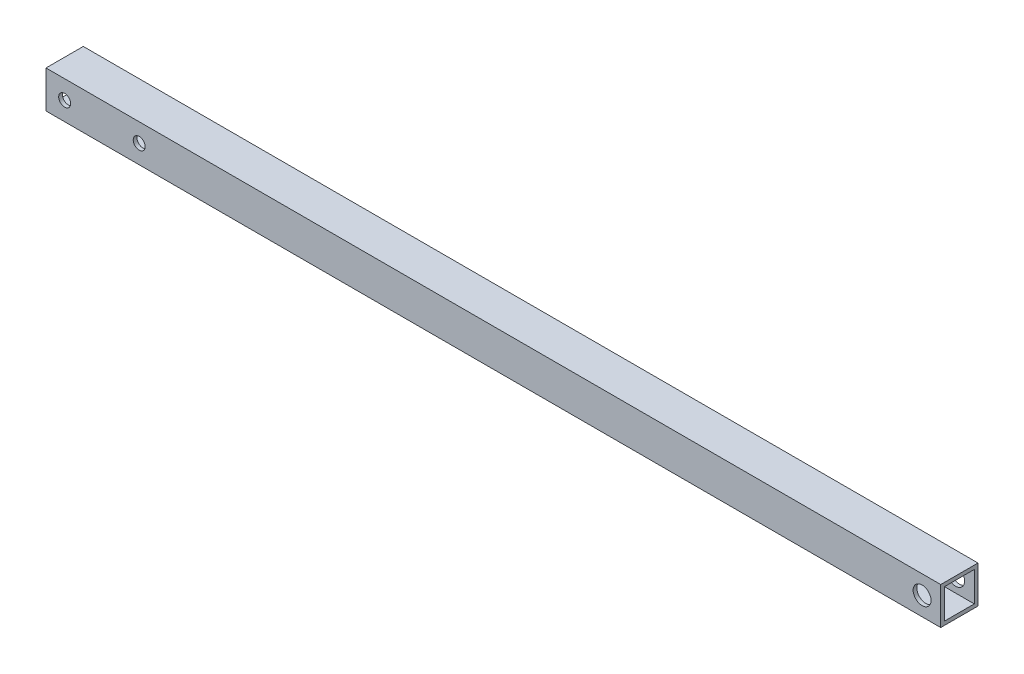
ISO-10303-21;
HEADER;
FILE_DESCRIPTION(('STEP AP214'),'2;1');
FILE_NAME('part.step','',(''),(''),'','','');
FILE_SCHEMA(('AUTOMOTIVE_DESIGN { 1 0 10303 214 1 1 1 1 }'));
ENDSEC;
DATA;
#1=APPLICATION_CONTEXT('core data for automotive mechanical design processes');
#2=APPLICATION_PROTOCOL_DEFINITION('international standard','automotive_design',2000,#1);
#3=PRODUCT_CONTEXT('',#1,'mechanical');
#4=PRODUCT('Part','Part','',(#3));
#5=PRODUCT_RELATED_PRODUCT_CATEGORY('part','',(#4));
#6=PRODUCT_DEFINITION_FORMATION('','',#4);
#7=PRODUCT_DEFINITION_CONTEXT('part definition',#1,'design');
#8=PRODUCT_DEFINITION('design','',#6,#7);
#9=PRODUCT_DEFINITION_SHAPE('','',#8);
#10=(LENGTH_UNIT() NAMED_UNIT(*) SI_UNIT(.MILLI.,.METRE.));
#11=(NAMED_UNIT(*) PLANE_ANGLE_UNIT() SI_UNIT($,.RADIAN.));
#12=(NAMED_UNIT(*) SI_UNIT($,.STERADIAN.) SOLID_ANGLE_UNIT());
#13=UNCERTAINTY_MEASURE_WITH_UNIT(LENGTH_MEASURE(1.E-05),#10,'distance_accuracy_value','');
#14=(GEOMETRIC_REPRESENTATION_CONTEXT(3) GLOBAL_UNCERTAINTY_ASSIGNED_CONTEXT((#13)) GLOBAL_UNIT_ASSIGNED_CONTEXT((#10,
#11,#12)) REPRESENTATION_CONTEXT('',''));
#15=CARTESIAN_POINT('',(0.,0.,0.));
#16=DIRECTION('',(0.,0.,1.));
#17=DIRECTION('',(1.,0.,0.));
#18=AXIS2_PLACEMENT_3D('',#15,#16,#17);
#19=CARTESIAN_POINT('',(-567.294734199927,244.999999997917,10.));
#20=DIRECTION('',(0.,0.,-1.));
#21=DIRECTION('',(-1.,0.,0.));
#22=AXIS2_PLACEMENT_3D('',#19,#20,#21);
#23=CYLINDRICAL_SURFACE('',#22,1.60000000000002);
#24=CARTESIAN_POINT('',(-567.294734199927,244.999999997917,0.999999999999999));
#25=DIRECTION('',(0.,0.,-1.));
#26=DIRECTION('',(-1.,0.,0.));
#27=AXIS2_PLACEMENT_3D('',#24,#25,#26);
#28=CIRCLE('',#27,1.60000000000002);
#29=CARTESIAN_POINT('',(-568.894734199927,244.999999997917,0.999999999999999));
#30=VERTEX_POINT('',#29);
#31=EDGE_CURVE('E145',#30,#30,#28,.T.);
#32=ORIENTED_EDGE('',*,*,#31,.F.);
#33=EDGE_LOOP('',(#32));
#34=FACE_BOUND('',#33,.T.);
#35=CARTESIAN_POINT('',(-567.294734199927,244.999999997917,0.));
#36=DIRECTION('',(0.,0.,1.));
#37=DIRECTION('',(1.,0.,0.));
#38=AXIS2_PLACEMENT_3D('',#35,#36,#37);
#39=CIRCLE('',#38,1.60000000000002);
#40=CARTESIAN_POINT('',(-565.694734199927,244.999999997917,0.));
#41=VERTEX_POINT('',#40);
#42=EDGE_CURVE('E158',#41,#41,#39,.T.);
#43=ORIENTED_EDGE('',*,*,#42,.F.);
#44=EDGE_LOOP('',(#43));
#45=FACE_BOUND('',#44,.T.);
#46=ADVANCED_FACE('F33',(#34,#45),#23,.F.);
#47=CARTESIAN_POINT('',(-547.294734199927,244.999999997917,10.));
#48=DIRECTION('',(0.,0.,-1.));
#49=DIRECTION('',(-1.,0.,0.));
#50=AXIS2_PLACEMENT_3D('',#47,#48,#49);
#51=CYLINDRICAL_SURFACE('',#50,1.60000000000002);
#52=CARTESIAN_POINT('',(-547.294734199927,244.999999997917,0.999999999999999));
#53=DIRECTION('',(0.,0.,-1.));
#54=DIRECTION('',(-1.,0.,0.));
#55=AXIS2_PLACEMENT_3D('',#52,#53,#54);
#56=CIRCLE('',#55,1.60000000000002);
#57=CARTESIAN_POINT('',(-548.894734199927,244.999999997917,0.999999999999999));
#58=VERTEX_POINT('',#57);
#59=EDGE_CURVE('E142',#58,#58,#56,.T.);
#60=ORIENTED_EDGE('',*,*,#59,.F.);
#61=EDGE_LOOP('',(#60));
#62=FACE_BOUND('',#61,.T.);
#63=CARTESIAN_POINT('',(-547.294734199927,244.999999997917,0.));
#64=DIRECTION('',(0.,0.,1.));
#65=DIRECTION('',(1.,0.,0.));
#66=AXIS2_PLACEMENT_3D('',#63,#64,#65);
#67=CIRCLE('',#66,1.60000000000002);
#68=CARTESIAN_POINT('',(-545.694734199927,244.999999997917,0.));
#69=VERTEX_POINT('',#68);
#70=EDGE_CURVE('E152',#69,#69,#67,.T.);
#71=ORIENTED_EDGE('',*,*,#70,.F.);
#72=EDGE_LOOP('',(#71));
#73=FACE_BOUND('',#72,.T.);
#74=ADVANCED_FACE('F215',(#62,#73),#51,.F.);
#75=CARTESIAN_POINT('',(-337.294734200061,245.000000000002,10.));
#76=DIRECTION('',(0.,0.,-1.));
#77=DIRECTION('',(-1.,0.,0.));
#78=AXIS2_PLACEMENT_3D('',#75,#76,#77);
#79=CYLINDRICAL_SURFACE('',#78,2.40000000000003);
#80=CARTESIAN_POINT('',(-337.294734200061,245.000000000002,0.999999999999999));
#81=DIRECTION('',(0.,0.,-1.));
#82=DIRECTION('',(-1.,0.,0.));
#83=AXIS2_PLACEMENT_3D('',#80,#81,#82);
#84=CIRCLE('',#83,2.40000000000003);
#85=CARTESIAN_POINT('',(-339.694734200061,245.000000000002,0.999999999999999));
#86=VERTEX_POINT('',#85);
#87=EDGE_CURVE('E37',#86,#86,#84,.T.);
#88=ORIENTED_EDGE('',*,*,#87,.F.);
#89=EDGE_LOOP('',(#88));
#90=FACE_BOUND('',#89,.T.);
#91=CARTESIAN_POINT('',(-337.294734200061,245.000000000002,0.));
#92=DIRECTION('',(0.,0.,1.));
#93=DIRECTION('',(1.,0.,0.));
#94=AXIS2_PLACEMENT_3D('',#91,#92,#93);
#95=CIRCLE('',#94,2.40000000000003);
#96=CARTESIAN_POINT('',(-334.89473420006,245.000000000002,0.));
#97=VERTEX_POINT('',#96);
#98=EDGE_CURVE('E148',#97,#97,#95,.T.);
#99=ORIENTED_EDGE('',*,*,#98,.F.);
#100=EDGE_LOOP('',(#99));
#101=FACE_BOUND('',#100,.T.);
#102=ADVANCED_FACE('F201',(#90,#101),#79,.F.);
#103=CARTESIAN_POINT('',(0.,0.,10.));
#104=DIRECTION('',(0.,0.,1.));
#105=DIRECTION('',(1.,0.,0.));
#106=AXIS2_PLACEMENT_3D('',#103,#104,#105);
#107=PLANE('',#106);
#108=CARTESIAN_POINT('',(-547.294734199927,244.999999997917,10.));
#109=DIRECTION('',(0.,0.,1.));
#110=DIRECTION('',(1.,0.,0.));
#111=AXIS2_PLACEMENT_3D('',#108,#109,#110);
#112=CIRCLE('',#111,1.60000000000002);
#113=CARTESIAN_POINT('',(-545.694734199927,244.999999997917,10.));
#114=VERTEX_POINT('',#113);
#115=EDGE_CURVE('E155',#114,#114,#112,.T.);
#116=ORIENTED_EDGE('',*,*,#115,.F.);
#117=EDGE_LOOP('',(#116));
#118=FACE_BOUND('',#117,.T.);
#119=DIRECTION('',(0.,1.,0.));
#120=VECTOR('',#119,1.);
#121=CARTESIAN_POINT('',(-332.294734200061,240.000000000002,10.));
#122=LINE('',#121,#120);
#123=CARTESIAN_POINT('',(-332.294734200061,240.000000000002,10.));
#124=VERTEX_POINT('',#123);
#125=CARTESIAN_POINT('',(-332.294734200061,250.000000000002,10.));
#126=VERTEX_POINT('',#125);
#127=EDGE_CURVE('E167',#124,#126,#122,.T.);
#128=ORIENTED_EDGE('',*,*,#127,.T.);
#129=DIRECTION('',(-1.,0.,0.));
#130=VECTOR('',#129,1.);
#131=CARTESIAN_POINT('',(-332.294734200061,250.000000000002,10.));
#132=LINE('',#131,#130);
#133=CARTESIAN_POINT('',(-572.29473420006,250.000000000002,10.));
#134=VERTEX_POINT('',#133);
#135=EDGE_CURVE('E170',#126,#134,#132,.T.);
#136=ORIENTED_EDGE('',*,*,#135,.T.);
#137=DIRECTION('',(0.,-1.,0.));
#138=VECTOR('',#137,1.);
#139=CARTESIAN_POINT('',(-572.29473420006,240.000000000002,10.));
#140=LINE('',#139,#138);
#141=CARTESIAN_POINT('',(-572.29473420006,240.000000000002,10.));
#142=VERTEX_POINT('',#141);
#143=EDGE_CURVE('E173',#134,#142,#140,.T.);
#144=ORIENTED_EDGE('',*,*,#143,.T.);
#145=DIRECTION('',(1.,0.,0.));
#146=VECTOR('',#145,1.);
#147=CARTESIAN_POINT('',(-332.294734200061,240.000000000002,10.));
#148=LINE('',#147,#146);
#149=EDGE_CURVE('E175',#142,#124,#148,.T.);
#150=ORIENTED_EDGE('',*,*,#149,.T.);
#151=EDGE_LOOP('',(#128,#136,#144,#150));
#152=FACE_BOUND('',#151,.T.);
#153=CARTESIAN_POINT('',(-567.294734199927,244.999999997917,10.));
#154=DIRECTION('',(0.,0.,1.));
#155=DIRECTION('',(1.,0.,0.));
#156=AXIS2_PLACEMENT_3D('',#153,#154,#155);
#157=CIRCLE('',#156,1.60000000000002);
#158=CARTESIAN_POINT('',(-565.694734199927,244.999999997917,10.));
#159=VERTEX_POINT('',#158);
#160=EDGE_CURVE('E161',#159,#159,#157,.T.);
#161=ORIENTED_EDGE('',*,*,#160,.F.);
#162=EDGE_LOOP('',(#161));
#163=FACE_BOUND('',#162,.T.);
#164=CARTESIAN_POINT('',(-337.294734200061,245.000000000002,10.));
#165=DIRECTION('',(0.,0.,1.));
#166=DIRECTION('',(1.,0.,0.));
#167=AXIS2_PLACEMENT_3D('',#164,#165,#166);
#168=CIRCLE('',#167,2.40000000000003);
#169=CARTESIAN_POINT('',(-334.89473420006,245.000000000002,10.));
#170=VERTEX_POINT('',#169);
#171=EDGE_CURVE('E149',#170,#170,#168,.T.);
#172=ORIENTED_EDGE('',*,*,#171,.F.);
#173=EDGE_LOOP('',(#172));
#174=FACE_BOUND('',#173,.T.);
#175=ADVANCED_FACE('F204',(#118,#152,#163,#174),#107,.T.);
#176=CARTESIAN_POINT('',(0.,0.,0.));
#177=DIRECTION('',(0.,0.,1.));
#178=DIRECTION('',(1.,0.,0.));
#179=AXIS2_PLACEMENT_3D('',#176,#177,#178);
#180=PLANE('',#179);
#181=DIRECTION('',(0.,1.,0.));
#182=VECTOR('',#181,1.);
#183=CARTESIAN_POINT('',(-332.294734200061,240.000000000002,0.));
#184=LINE('',#183,#182);
#185=CARTESIAN_POINT('',(-332.294734200061,240.000000000002,0.));
#186=VERTEX_POINT('',#185);
#187=CARTESIAN_POINT('',(-332.294734200061,250.000000000002,0.));
#188=VERTEX_POINT('',#187);
#189=EDGE_CURVE('E164',#186,#188,#184,.T.);
#190=ORIENTED_EDGE('',*,*,#189,.F.);
#191=DIRECTION('',(1.,0.,0.));
#192=VECTOR('',#191,1.);
#193=CARTESIAN_POINT('',(-332.294734200061,240.000000000002,0.));
#194=LINE('',#193,#192);
#195=CARTESIAN_POINT('',(-572.29473420006,240.000000000002,0.));
#196=VERTEX_POINT('',#195);
#197=EDGE_CURVE('E171',#196,#186,#194,.T.);
#198=ORIENTED_EDGE('',*,*,#197,.F.);
#199=DIRECTION('',(0.,-1.,0.));
#200=VECTOR('',#199,1.);
#201=CARTESIAN_POINT('',(-572.29473420006,240.000000000002,0.));
#202=LINE('',#201,#200);
#203=CARTESIAN_POINT('',(-572.29473420006,250.000000000002,0.));
#204=VERTEX_POINT('',#203);
#205=EDGE_CURVE('E182',#204,#196,#202,.T.);
#206=ORIENTED_EDGE('',*,*,#205,.F.);
#207=DIRECTION('',(-1.,0.,0.));
#208=VECTOR('',#207,1.);
#209=CARTESIAN_POINT('',(-332.294734200061,250.000000000002,0.));
#210=LINE('',#209,#208);
#211=EDGE_CURVE('E180',#188,#204,#210,.T.);
#212=ORIENTED_EDGE('',*,*,#211,.F.);
#213=EDGE_LOOP('',(#190,#198,#206,#212));
#214=FACE_BOUND('',#213,.T.);
#215=ORIENTED_EDGE('',*,*,#42,.T.);
#216=EDGE_LOOP('',(#215));
#217=FACE_BOUND('',#216,.T.);
#218=ORIENTED_EDGE('',*,*,#70,.T.);
#219=EDGE_LOOP('',(#218));
#220=FACE_BOUND('',#219,.T.);
#221=ORIENTED_EDGE('',*,*,#98,.T.);
#222=EDGE_LOOP('',(#221));
#223=FACE_BOUND('',#222,.T.);
#224=ADVANCED_FACE('F206',(#214,#217,#220,#223),#180,.F.);
#225=CARTESIAN_POINT('',(-332.294734200061,240.000000000002,10.));
#226=DIRECTION('',(-1.,0.,0.));
#227=DIRECTION('',(0.,0.,1.));
#228=AXIS2_PLACEMENT_3D('',#225,#226,#227);
#229=PLANE('',#228);
#230=DIRECTION('',(0.,0.,-1.));
#231=VECTOR('',#230,1.);
#232=CARTESIAN_POINT('',(-332.294734200061,249.000000000002,1.));
#233=LINE('',#232,#231);
#234=CARTESIAN_POINT('',(-332.294734200061,249.000000000002,9.));
#235=VERTEX_POINT('',#234);
#236=CARTESIAN_POINT('',(-332.294734200061,249.000000000002,1.));
#237=VERTEX_POINT('',#236);
#238=EDGE_CURVE('E108',#235,#237,#233,.T.);
#239=ORIENTED_EDGE('',*,*,#238,.T.);
#240=DIRECTION('',(0.,-1.,0.));
#241=VECTOR('',#240,1.);
#242=CARTESIAN_POINT('',(-332.294734200061,241.000000000002,1.));
#243=LINE('',#242,#241);
#244=CARTESIAN_POINT('',(-332.294734200061,241.000000000002,1.));
#245=VERTEX_POINT('',#244);
#246=EDGE_CURVE('E102',#237,#245,#243,.T.);
#247=ORIENTED_EDGE('',*,*,#246,.T.);
#248=DIRECTION('',(0.,0.,1.));
#249=VECTOR('',#248,1.);
#250=CARTESIAN_POINT('',(-332.294734200061,241.000000000002,1.));
#251=LINE('',#250,#249);
#252=CARTESIAN_POINT('',(-332.294734200061,241.000000000002,9.));
#253=VERTEX_POINT('',#252);
#254=EDGE_CURVE('E111',#245,#253,#251,.T.);
#255=ORIENTED_EDGE('',*,*,#254,.T.);
#256=DIRECTION('',(0.,1.,0.));
#257=VECTOR('',#256,1.);
#258=CARTESIAN_POINT('',(-332.294734200061,241.000000000002,9.));
#259=LINE('',#258,#257);
#260=EDGE_CURVE('E50',#253,#235,#259,.T.);
#261=ORIENTED_EDGE('',*,*,#260,.T.);
#262=EDGE_LOOP('',(#239,#247,#255,#261));
#263=FACE_BOUND('',#262,.T.);
#264=ORIENTED_EDGE('',*,*,#189,.T.);
#265=DIRECTION('',(0.,0.,-1.));
#266=VECTOR('',#265,1.);
#267=CARTESIAN_POINT('',(-332.294734200061,250.000000000002,10.));
#268=LINE('',#267,#266);
#269=EDGE_CURVE('E11',#126,#188,#268,.T.);
#270=ORIENTED_EDGE('',*,*,#269,.F.);
#271=ORIENTED_EDGE('',*,*,#127,.F.);
#272=DIRECTION('',(0.,0.,-1.));
#273=VECTOR('',#272,1.);
#274=CARTESIAN_POINT('',(-332.294734200061,240.000000000002,10.));
#275=LINE('',#274,#273);
#276=EDGE_CURVE('E177',#124,#186,#275,.T.);
#277=ORIENTED_EDGE('',*,*,#276,.T.);
#278=EDGE_LOOP('',(#264,#270,#271,#277));
#279=FACE_BOUND('',#278,.T.);
#280=ADVANCED_FACE('F35',(#263,#279),#229,.F.);
#281=CARTESIAN_POINT('',(-332.294734200061,250.000000000002,10.));
#282=DIRECTION('',(0.,-1.,0.));
#283=DIRECTION('',(1.,0.,0.));
#284=AXIS2_PLACEMENT_3D('',#281,#282,#283);
#285=PLANE('',#284);
#286=ORIENTED_EDGE('',*,*,#211,.T.);
#287=DIRECTION('',(0.,0.,-1.));
#288=VECTOR('',#287,1.);
#289=CARTESIAN_POINT('',(-572.29473420006,250.000000000002,10.));
#290=LINE('',#289,#288);
#291=EDGE_CURVE('E42',#134,#204,#290,.T.);
#292=ORIENTED_EDGE('',*,*,#291,.F.);
#293=ORIENTED_EDGE('',*,*,#135,.F.);
#294=ORIENTED_EDGE('',*,*,#269,.T.);
#295=EDGE_LOOP('',(#286,#292,#293,#294));
#296=FACE_BOUND('',#295,.T.);
#297=ADVANCED_FACE('F337',(#296),#285,.F.);
#298=CARTESIAN_POINT('',(-572.29473420006,240.000000000002,10.));
#299=DIRECTION('',(1.,0.,0.));
#300=DIRECTION('',(0.,0.,-1.));
#301=AXIS2_PLACEMENT_3D('',#298,#299,#300);
#302=PLANE('',#301);
#303=DIRECTION('',(0.,0.,1.));
#304=VECTOR('',#303,1.);
#305=CARTESIAN_POINT('',(-572.29473420006,241.000000000002,1.));
#306=LINE('',#305,#304);
#307=CARTESIAN_POINT('',(-572.29473420006,241.000000000002,0.999999999999999));
#308=VERTEX_POINT('',#307);
#309=CARTESIAN_POINT('',(-572.29473420006,241.000000000002,9.));
#310=VERTEX_POINT('',#309);
#311=EDGE_CURVE('E126',#308,#310,#306,.T.);
#312=ORIENTED_EDGE('',*,*,#311,.F.);
#313=DIRECTION('',(0.,-1.,0.));
#314=VECTOR('',#313,1.);
#315=CARTESIAN_POINT('',(-572.29473420006,241.000000000002,1.));
#316=LINE('',#315,#314);
#317=CARTESIAN_POINT('',(-572.29473420006,249.000000000002,1.));
#318=VERTEX_POINT('',#317);
#319=EDGE_CURVE('E58',#318,#308,#316,.T.);
#320=ORIENTED_EDGE('',*,*,#319,.F.);
#321=DIRECTION('',(0.,0.,-1.));
#322=VECTOR('',#321,1.);
#323=CARTESIAN_POINT('',(-572.29473420006,249.000000000002,1.));
#324=LINE('',#323,#322);
#325=CARTESIAN_POINT('',(-572.29473420006,249.000000000002,9.));
#326=VERTEX_POINT('',#325);
#327=EDGE_CURVE('E117',#326,#318,#324,.T.);
#328=ORIENTED_EDGE('',*,*,#327,.F.);
#329=DIRECTION('',(0.,1.,0.));
#330=VECTOR('',#329,1.);
#331=CARTESIAN_POINT('',(-572.29473420006,241.000000000002,9.));
#332=LINE('',#331,#330);
#333=EDGE_CURVE('E120',#310,#326,#332,.T.);
#334=ORIENTED_EDGE('',*,*,#333,.F.);
#335=EDGE_LOOP('',(#312,#320,#328,#334));
#336=FACE_BOUND('',#335,.T.);
#337=ORIENTED_EDGE('',*,*,#205,.T.);
#338=DIRECTION('',(0.,0.,-1.));
#339=VECTOR('',#338,1.);
#340=CARTESIAN_POINT('',(-572.29473420006,240.000000000002,10.));
#341=LINE('',#340,#339);
#342=EDGE_CURVE('E187',#142,#196,#341,.T.);
#343=ORIENTED_EDGE('',*,*,#342,.F.);
#344=ORIENTED_EDGE('',*,*,#143,.F.);
#345=ORIENTED_EDGE('',*,*,#291,.T.);
#346=EDGE_LOOP('',(#337,#343,#344,#345));
#347=FACE_BOUND('',#346,.T.);
#348=ADVANCED_FACE('F238',(#336,#347),#302,.F.);
#349=CARTESIAN_POINT('',(-332.294734200061,240.000000000002,10.));
#350=DIRECTION('',(0.,1.,0.));
#351=DIRECTION('',(-1.,0.,0.));
#352=AXIS2_PLACEMENT_3D('',#349,#350,#351);
#353=PLANE('',#352);
#354=ORIENTED_EDGE('',*,*,#197,.T.);
#355=ORIENTED_EDGE('',*,*,#276,.F.);
#356=ORIENTED_EDGE('',*,*,#149,.F.);
#357=ORIENTED_EDGE('',*,*,#342,.T.);
#358=EDGE_LOOP('',(#354,#355,#356,#357));
#359=FACE_BOUND('',#358,.T.);
#360=ADVANCED_FACE('F231',(#359),#353,.F.);
#361=CARTESIAN_POINT('',(-567.294734199927,244.999999997917,9.));
#362=DIRECTION('',(0.,0.,1.));
#363=DIRECTION('',(1.,0.,0.));
#364=AXIS2_PLACEMENT_3D('',#361,#362,#363);
#365=CIRCLE('',#364,1.60000000000002);
#366=CARTESIAN_POINT('',(-565.694734199927,244.999999997917,9.));
#367=VERTEX_POINT('',#366);
#368=EDGE_CURVE('E139',#367,#367,#365,.T.);
#369=ORIENTED_EDGE('',*,*,#368,.F.);
#370=EDGE_LOOP('',(#369));
#371=FACE_BOUND('',#370,.T.);
#372=ORIENTED_EDGE('',*,*,#160,.T.);
#373=EDGE_LOOP('',(#372));
#374=FACE_BOUND('',#373,.T.);
#375=ADVANCED_FACE('F222',(#371,#374),#23,.F.);
#376=CARTESIAN_POINT('',(-547.294734199927,244.999999997917,9.));
#377=DIRECTION('',(0.,0.,1.));
#378=DIRECTION('',(1.,0.,0.));
#379=AXIS2_PLACEMENT_3D('',#376,#377,#378);
#380=CIRCLE('',#379,1.60000000000002);
#381=CARTESIAN_POINT('',(-545.694734199927,244.999999997917,9.));
#382=VERTEX_POINT('',#381);
#383=EDGE_CURVE('E136',#382,#382,#380,.T.);
#384=ORIENTED_EDGE('',*,*,#383,.F.);
#385=EDGE_LOOP('',(#384));
#386=FACE_BOUND('',#385,.T.);
#387=ORIENTED_EDGE('',*,*,#115,.T.);
#388=EDGE_LOOP('',(#387));
#389=FACE_BOUND('',#388,.T.);
#390=ADVANCED_FACE('F199',(#386,#389),#51,.F.);
#391=CARTESIAN_POINT('',(-337.294734200061,245.000000000002,9.));
#392=DIRECTION('',(0.,0.,1.));
#393=DIRECTION('',(1.,0.,0.));
#394=AXIS2_PLACEMENT_3D('',#391,#392,#393);
#395=CIRCLE('',#394,2.40000000000003);
#396=CARTESIAN_POINT('',(-334.89473420006,245.000000000002,9.));
#397=VERTEX_POINT('',#396);
#398=EDGE_CURVE('E132',#397,#397,#395,.T.);
#399=ORIENTED_EDGE('',*,*,#398,.F.);
#400=EDGE_LOOP('',(#399));
#401=FACE_BOUND('',#400,.T.);
#402=ORIENTED_EDGE('',*,*,#171,.T.);
#403=EDGE_LOOP('',(#402));
#404=FACE_BOUND('',#403,.T.);
#405=ADVANCED_FACE('F196',(#401,#404),#79,.F.);
#406=CARTESIAN_POINT('',(-332.294734200061,241.000000000002,1.));
#407=DIRECTION('',(0.,0.,-1.));
#408=DIRECTION('',(-1.,0.,0.));
#409=AXIS2_PLACEMENT_3D('',#406,#407,#408);
#410=PLANE('',#409);
#411=ORIENTED_EDGE('',*,*,#31,.T.);
#412=EDGE_LOOP('',(#411));
#413=FACE_BOUND('',#412,.T.);
#414=ORIENTED_EDGE('',*,*,#59,.T.);
#415=EDGE_LOOP('',(#414));
#416=FACE_BOUND('',#415,.T.);
#417=ORIENTED_EDGE('',*,*,#87,.T.);
#418=EDGE_LOOP('',(#417));
#419=FACE_BOUND('',#418,.T.);
#420=ORIENTED_EDGE('',*,*,#319,.T.);
#421=DIRECTION('',(-1.,0.,0.));
#422=VECTOR('',#421,1.);
#423=CARTESIAN_POINT('',(-332.294734200061,241.000000000002,1.));
#424=LINE('',#423,#422);
#425=EDGE_CURVE('E98',#245,#308,#424,.T.);
#426=ORIENTED_EDGE('',*,*,#425,.F.);
#427=ORIENTED_EDGE('',*,*,#246,.F.);
#428=DIRECTION('',(-1.,0.,0.));
#429=VECTOR('',#428,1.);
#430=CARTESIAN_POINT('',(-332.294734200061,249.000000000002,1.));
#431=LINE('',#430,#429);
#432=EDGE_CURVE('E130',#237,#318,#431,.T.);
#433=ORIENTED_EDGE('',*,*,#432,.T.);
#434=EDGE_LOOP('',(#420,#426,#427,#433));
#435=FACE_BOUND('',#434,.T.);
#436=ADVANCED_FACE('F100',(#413,#416,#419,#435),#410,.F.);
#437=CARTESIAN_POINT('',(-332.294734200061,249.000000000002,1.));
#438=DIRECTION('',(0.,1.,0.));
#439=DIRECTION('',(0.,0.,1.));
#440=AXIS2_PLACEMENT_3D('',#437,#438,#439);
#441=PLANE('',#440);
#442=ORIENTED_EDGE('',*,*,#327,.T.);
#443=ORIENTED_EDGE('',*,*,#432,.F.);
#444=ORIENTED_EDGE('',*,*,#238,.F.);
#445=DIRECTION('',(-1.,0.,0.));
#446=VECTOR('',#445,1.);
#447=CARTESIAN_POINT('',(-332.294734200061,249.000000000002,9.));
#448=LINE('',#447,#446);
#449=EDGE_CURVE('E133',#235,#326,#448,.T.);
#450=ORIENTED_EDGE('',*,*,#449,.T.);
#451=EDGE_LOOP('',(#442,#443,#444,#450));
#452=FACE_BOUND('',#451,.T.);
#453=ADVANCED_FACE('F248',(#452),#441,.F.);
#454=CARTESIAN_POINT('',(-332.294734200061,241.000000000002,9.));
#455=DIRECTION('',(0.,0.,1.));
#456=DIRECTION('',(1.,0.,0.));
#457=AXIS2_PLACEMENT_3D('',#454,#455,#456);
#458=PLANE('',#457);
#459=ORIENTED_EDGE('',*,*,#368,.T.);
#460=EDGE_LOOP('',(#459));
#461=FACE_BOUND('',#460,.T.);
#462=ORIENTED_EDGE('',*,*,#383,.T.);
#463=EDGE_LOOP('',(#462));
#464=FACE_BOUND('',#463,.T.);
#465=ORIENTED_EDGE('',*,*,#398,.T.);
#466=EDGE_LOOP('',(#465));
#467=FACE_BOUND('',#466,.T.);
#468=ORIENTED_EDGE('',*,*,#333,.T.);
#469=ORIENTED_EDGE('',*,*,#449,.F.);
#470=ORIENTED_EDGE('',*,*,#260,.F.);
#471=DIRECTION('',(-1.,0.,0.));
#472=VECTOR('',#471,1.);
#473=CARTESIAN_POINT('',(-332.294734200061,241.000000000002,9.));
#474=LINE('',#473,#472);
#475=EDGE_CURVE('E107',#253,#310,#474,.T.);
#476=ORIENTED_EDGE('',*,*,#475,.T.);
#477=EDGE_LOOP('',(#468,#469,#470,#476));
#478=FACE_BOUND('',#477,.T.);
#479=ADVANCED_FACE('F194',(#461,#464,#467,#478),#458,.F.);
#480=CARTESIAN_POINT('',(-332.294734200061,241.000000000002,1.));
#481=DIRECTION('',(0.,-1.,0.));
#482=DIRECTION('',(0.,0.,-1.));
#483=AXIS2_PLACEMENT_3D('',#480,#481,#482);
#484=PLANE('',#483);
#485=ORIENTED_EDGE('',*,*,#311,.T.);
#486=ORIENTED_EDGE('',*,*,#475,.F.);
#487=ORIENTED_EDGE('',*,*,#254,.F.);
#488=ORIENTED_EDGE('',*,*,#425,.T.);
#489=EDGE_LOOP('',(#485,#486,#487,#488));
#490=FACE_BOUND('',#489,.T.);
#491=ADVANCED_FACE('F112',(#490),#484,.F.);
#492=CLOSED_SHELL('',(#46,#74,#102,#175,#224,#280,#297,#348,#360,#375,#390,#405,#436,#453,#479,#491));
#493=MANIFOLD_SOLID_BREP('B2',#492);
#494=ADVANCED_BREP_SHAPE_REPRESENTATION('',(#18,#493),#14);
#495=SHAPE_DEFINITION_REPRESENTATION(#9,#494);
ENDSEC;
END-ISO-10303-21;
